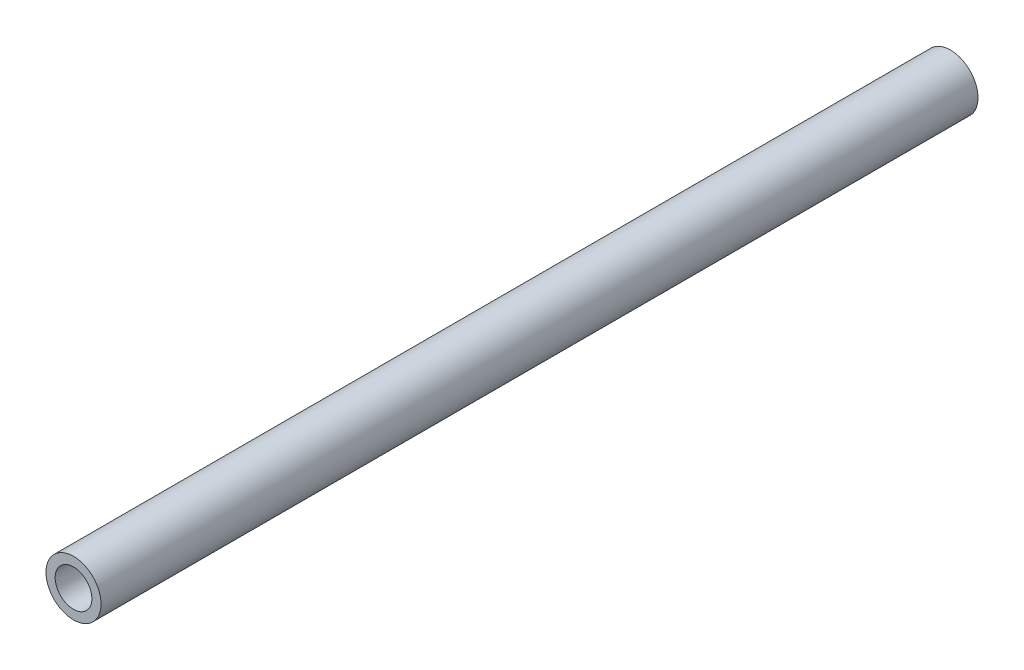
ISO-10303-21;
HEADER;
FILE_DESCRIPTION(('STEP AP214'),'2;1');
FILE_NAME('part.step','',(''),(''),'','','');
FILE_SCHEMA(('AUTOMOTIVE_DESIGN { 1 0 10303 214 1 1 1 1 }'));
ENDSEC;
DATA;
#1=APPLICATION_CONTEXT('core data for automotive mechanical design processes');
#2=APPLICATION_PROTOCOL_DEFINITION('international standard','automotive_design',2000,#1);
#3=PRODUCT_CONTEXT('',#1,'mechanical');
#4=PRODUCT('Part','Part','',(#3));
#5=PRODUCT_RELATED_PRODUCT_CATEGORY('part','',(#4));
#6=PRODUCT_DEFINITION_FORMATION('','',#4);
#7=PRODUCT_DEFINITION_CONTEXT('part definition',#1,'design');
#8=PRODUCT_DEFINITION('design','',#6,#7);
#9=PRODUCT_DEFINITION_SHAPE('','',#8);
#10=(LENGTH_UNIT() NAMED_UNIT(*) SI_UNIT(.MILLI.,.METRE.));
#11=(NAMED_UNIT(*) PLANE_ANGLE_UNIT() SI_UNIT($,.RADIAN.));
#12=(NAMED_UNIT(*) SI_UNIT($,.STERADIAN.) SOLID_ANGLE_UNIT());
#13=UNCERTAINTY_MEASURE_WITH_UNIT(LENGTH_MEASURE(1.E-05),#10,'distance_accuracy_value','');
#14=(GEOMETRIC_REPRESENTATION_CONTEXT(3) GLOBAL_UNCERTAINTY_ASSIGNED_CONTEXT((#13)) GLOBAL_UNIT_ASSIGNED_CONTEXT((#10,
#11,#12)) REPRESENTATION_CONTEXT('',''));
#15=CARTESIAN_POINT('',(0.,0.,0.));
#16=DIRECTION('',(0.,0.,1.));
#17=DIRECTION('',(1.,0.,0.));
#18=AXIS2_PLACEMENT_3D('',#15,#16,#17);
#19=CARTESIAN_POINT('',(-255.,51.5,-51.));
#20=DIRECTION('',(0.,0.,1.));
#21=DIRECTION('',(1.,0.,0.));
#22=AXIS2_PLACEMENT_3D('',#19,#20,#21);
#23=CYLINDRICAL_SURFACE('',#22,3.);
#24=CARTESIAN_POINT('',(-255.,51.5,-51.));
#25=DIRECTION('',(0.,0.,1.));
#26=DIRECTION('',(1.,0.,0.));
#27=AXIS2_PLACEMENT_3D('',#24,#25,#26);
#28=CIRCLE('',#27,3.);
#29=CARTESIAN_POINT('',(-252.,51.5,-51.));
#30=VERTEX_POINT('',#29);
#31=EDGE_CURVE('E10',#30,#30,#28,.T.);
#32=ORIENTED_EDGE('',*,*,#31,.T.);
#33=EDGE_LOOP('',(#32));
#34=FACE_BOUND('',#33,.T.);
#35=CARTESIAN_POINT('',(-255.,51.5,44.5));
#36=DIRECTION('',(0.,0.,1.));
#37=DIRECTION('',(1.,0.,0.));
#38=AXIS2_PLACEMENT_3D('',#35,#36,#37);
#39=CIRCLE('',#38,3.);
#40=CARTESIAN_POINT('',(-252.,51.5,44.5));
#41=VERTEX_POINT('',#40);
#42=EDGE_CURVE('E45',#41,#41,#39,.T.);
#43=ORIENTED_EDGE('',*,*,#42,.F.);
#44=EDGE_LOOP('',(#43));
#45=FACE_BOUND('',#44,.T.);
#46=ADVANCED_FACE('F39',(#34,#45),#23,.T.);
#47=CARTESIAN_POINT('',(-255.,51.5,-51.));
#48=DIRECTION('',(0.,0.,1.));
#49=DIRECTION('',(1.,0.,0.));
#50=AXIS2_PLACEMENT_3D('',#47,#48,#49);
#51=PLANE('',#50);
#52=CARTESIAN_POINT('',(-255.,51.5,-51.));
#53=DIRECTION('',(0.,0.,1.));
#54=DIRECTION('',(1.,0.,0.));
#55=AXIS2_PLACEMENT_3D('',#52,#53,#54);
#56=CIRCLE('',#55,2.);
#57=CARTESIAN_POINT('',(-253.,51.5,-51.));
#58=VERTEX_POINT('',#57);
#59=EDGE_CURVE('E47',#58,#58,#56,.T.);
#60=ORIENTED_EDGE('',*,*,#59,.T.);
#61=EDGE_LOOP('',(#60));
#62=FACE_BOUND('',#61,.T.);
#63=ORIENTED_EDGE('',*,*,#31,.F.);
#64=EDGE_LOOP('',(#63));
#65=FACE_BOUND('',#64,.T.);
#66=ADVANCED_FACE('F60',(#62,#65),#51,.F.);
#67=CARTESIAN_POINT('',(-255.,51.5,44.5));
#68=DIRECTION('',(0.,0.,1.));
#69=DIRECTION('',(1.,0.,0.));
#70=AXIS2_PLACEMENT_3D('',#67,#68,#69);
#71=PLANE('',#70);
#72=CARTESIAN_POINT('',(-255.,51.5,44.5));
#73=DIRECTION('',(0.,0.,1.));
#74=DIRECTION('',(1.,0.,0.));
#75=AXIS2_PLACEMENT_3D('',#72,#73,#74);
#76=CIRCLE('',#75,2.);
#77=CARTESIAN_POINT('',(-253.,51.5,44.5));
#78=VERTEX_POINT('',#77);
#79=EDGE_CURVE('E51',#78,#78,#76,.T.);
#80=ORIENTED_EDGE('',*,*,#79,.F.);
#81=EDGE_LOOP('',(#80));
#82=FACE_BOUND('',#81,.T.);
#83=ORIENTED_EDGE('',*,*,#42,.T.);
#84=EDGE_LOOP('',(#83));
#85=FACE_BOUND('',#84,.T.);
#86=ADVANCED_FACE('F64',(#82,#85),#71,.T.);
#87=CARTESIAN_POINT('',(-255.,51.5,-51.));
#88=DIRECTION('',(0.,0.,1.));
#89=DIRECTION('',(1.,0.,0.));
#90=AXIS2_PLACEMENT_3D('',#87,#88,#89);
#91=CYLINDRICAL_SURFACE('',#90,2.);
#92=ORIENTED_EDGE('',*,*,#59,.F.);
#93=EDGE_LOOP('',(#92));
#94=FACE_BOUND('',#93,.T.);
#95=ORIENTED_EDGE('',*,*,#79,.T.);
#96=EDGE_LOOP('',(#95));
#97=FACE_BOUND('',#96,.T.);
#98=ADVANCED_FACE('F58',(#94,#97),#91,.F.);
#99=CLOSED_SHELL('',(#46,#66,#86,#98));
#100=MANIFOLD_SOLID_BREP('B2',#99);
#101=ADVANCED_BREP_SHAPE_REPRESENTATION('',(#18,#100),#14);
#102=SHAPE_DEFINITION_REPRESENTATION(#9,#101);
ENDSEC;
END-ISO-10303-21;
